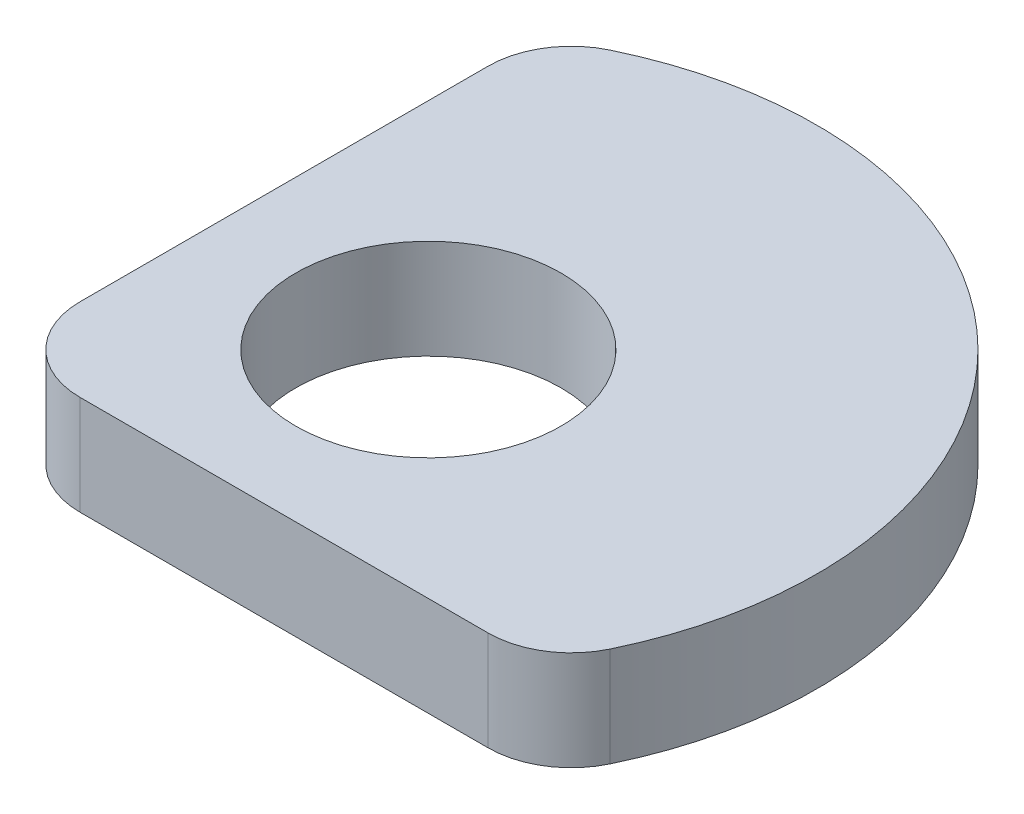
ISO-10303-21;
HEADER;
FILE_DESCRIPTION(('STEP AP214'),'2;1');
FILE_NAME('part.step','',(''),(''),'','','');
FILE_SCHEMA(('AUTOMOTIVE_DESIGN { 1 0 10303 214 1 1 1 1 }'));
ENDSEC;
DATA;
#1=APPLICATION_CONTEXT('core data for automotive mechanical design processes');
#2=APPLICATION_PROTOCOL_DEFINITION('international standard','automotive_design',2000,#1);
#3=PRODUCT_CONTEXT('',#1,'mechanical');
#4=PRODUCT('Part','Part','',(#3));
#5=PRODUCT_RELATED_PRODUCT_CATEGORY('part','',(#4));
#6=PRODUCT_DEFINITION_FORMATION('','',#4);
#7=PRODUCT_DEFINITION_CONTEXT('part definition',#1,'design');
#8=PRODUCT_DEFINITION('design','',#6,#7);
#9=PRODUCT_DEFINITION_SHAPE('','',#8);
#10=(LENGTH_UNIT() NAMED_UNIT(*) SI_UNIT(.MILLI.,.METRE.));
#11=(NAMED_UNIT(*) PLANE_ANGLE_UNIT() SI_UNIT($,.RADIAN.));
#12=(NAMED_UNIT(*) SI_UNIT($,.STERADIAN.) SOLID_ANGLE_UNIT());
#13=UNCERTAINTY_MEASURE_WITH_UNIT(LENGTH_MEASURE(1.E-05),#10,'distance_accuracy_value','');
#14=(GEOMETRIC_REPRESENTATION_CONTEXT(3) GLOBAL_UNCERTAINTY_ASSIGNED_CONTEXT((#13)) GLOBAL_UNIT_ASSIGNED_CONTEXT((#10,
#11,#12)) REPRESENTATION_CONTEXT('',''));
#15=CARTESIAN_POINT('',(0.,0.,0.));
#16=DIRECTION('',(0.,0.,1.));
#17=DIRECTION('',(1.,0.,0.));
#18=AXIS2_PLACEMENT_3D('',#15,#16,#17);
#19=CARTESIAN_POINT('',(2.6,1.2,-2.6));
#20=DIRECTION('',(0.,-1.,0.));
#21=DIRECTION('',(0.,0.,-1.));
#22=AXIS2_PLACEMENT_3D('',#19,#20,#21);
#23=PLANE('',#22);
#24=CARTESIAN_POINT('',(2.6,1.2,-2.6));
#25=DIRECTION('',(0.,1.,0.));
#26=DIRECTION('',(0.,0.,-1.));
#27=AXIS2_PLACEMENT_3D('',#24,#25,#26);
#28=CIRCLE('',#27,4.68721665810319);
#29=CARTESIAN_POINT('',(6.82292813724663,1.2,-0.566068352266805));
#30=VERTEX_POINT('',#29);
#31=CARTESIAN_POINT('',(0.566068352266805,1.2,-6.82292813724663));
#32=VERTEX_POINT('',#31);
#33=EDGE_CURVE('E134',#30,#32,#28,.T.);
#34=ORIENTED_EDGE('',*,*,#33,.T.);
#35=CARTESIAN_POINT('',(1.,1.2,-5.92198234248673));
#36=DIRECTION('',(0.,-1.,0.));
#37=DIRECTION('',(0.,0.,-1.));
#38=AXIS2_PLACEMENT_3D('',#35,#36,#37);
#39=CIRCLE('',#38,1.);
#40=CARTESIAN_POINT('',(0.,1.2,-5.92198234248673));
#41=VERTEX_POINT('',#40);
#42=EDGE_CURVE('E155',#32,#41,#39,.F.);
#43=ORIENTED_EDGE('',*,*,#42,.T.);
#44=DIRECTION('',(0.,0.,1.));
#45=VECTOR('',#44,1.);
#46=CARTESIAN_POINT('',(0.,1.2,0.));
#47=LINE('',#46,#45);
#48=CARTESIAN_POINT('',(0.,1.2,-1.));
#49=VERTEX_POINT('',#48);
#50=EDGE_CURVE('E114',#41,#49,#47,.T.);
#51=ORIENTED_EDGE('',*,*,#50,.T.);
#52=CARTESIAN_POINT('',(1.,1.2,-1.));
#53=DIRECTION('',(0.,-1.,0.));
#54=DIRECTION('',(0.,0.,-1.));
#55=AXIS2_PLACEMENT_3D('',#52,#53,#54);
#56=CIRCLE('',#55,1.);
#57=CARTESIAN_POINT('',(1.,1.2,0.));
#58=VERTEX_POINT('',#57);
#59=EDGE_CURVE('E61',#49,#58,#56,.F.);
#60=ORIENTED_EDGE('',*,*,#59,.T.);
#61=DIRECTION('',(1.,0.,0.));
#62=VECTOR('',#61,1.);
#63=CARTESIAN_POINT('',(0.,1.2,0.));
#64=LINE('',#63,#62);
#65=CARTESIAN_POINT('',(5.92198234248673,1.2,0.));
#66=VERTEX_POINT('',#65);
#67=EDGE_CURVE('E161',#58,#66,#64,.T.);
#68=ORIENTED_EDGE('',*,*,#67,.T.);
#69=CARTESIAN_POINT('',(5.92198234248673,1.2,-1.));
#70=DIRECTION('',(0.,-1.,0.));
#71=DIRECTION('',(0.,0.,-1.));
#72=AXIS2_PLACEMENT_3D('',#69,#70,#71);
#73=CIRCLE('',#72,1.);
#74=EDGE_CURVE('E150',#66,#30,#73,.F.);
#75=ORIENTED_EDGE('',*,*,#74,.T.);
#76=EDGE_LOOP('',(#34,#43,#51,#60,#68,#75));
#77=FACE_BOUND('',#76,.T.);
#78=CARTESIAN_POINT('',(2.6,1.2,-2.6));
#79=DIRECTION('',(0.,1.,0.));
#80=DIRECTION('',(0.,0.,1.));
#81=AXIS2_PLACEMENT_3D('',#78,#79,#80);
#82=CIRCLE('',#81,1.6);
#83=CARTESIAN_POINT('',(2.6,1.2,-1.));
#84=VERTEX_POINT('',#83);
#85=EDGE_CURVE('E124',#84,#84,#82,.T.);
#86=ORIENTED_EDGE('',*,*,#85,.F.);
#87=EDGE_LOOP('',(#86));
#88=FACE_BOUND('',#87,.T.);
#89=ADVANCED_FACE('F39',(#77,#88),#23,.F.);
#90=CARTESIAN_POINT('',(2.6,0.,-2.6));
#91=DIRECTION('',(0.,-1.,0.));
#92=DIRECTION('',(0.,0.,-1.));
#93=AXIS2_PLACEMENT_3D('',#90,#91,#92);
#94=PLANE('',#93);
#95=DIRECTION('',(0.,0.,1.));
#96=VECTOR('',#95,1.);
#97=CARTESIAN_POINT('',(0.,0.,0.));
#98=LINE('',#97,#96);
#99=CARTESIAN_POINT('',(0.,0.,-5.92198234248673));
#100=VERTEX_POINT('',#99);
#101=CARTESIAN_POINT('',(0.,0.,-1.));
#102=VERTEX_POINT('',#101);
#103=EDGE_CURVE('E112',#100,#102,#98,.T.);
#104=ORIENTED_EDGE('',*,*,#103,.F.);
#105=CARTESIAN_POINT('',(1.,0.,-5.92198234248673));
#106=DIRECTION('',(0.,-1.,0.));
#107=DIRECTION('',(0.,0.,-1.));
#108=AXIS2_PLACEMENT_3D('',#105,#106,#107);
#109=CIRCLE('',#108,1.);
#110=CARTESIAN_POINT('',(0.566068352266805,0.,-6.82292813724663));
#111=VERTEX_POINT('',#110);
#112=EDGE_CURVE('E94',#100,#111,#109,.T.);
#113=ORIENTED_EDGE('',*,*,#112,.T.);
#114=CARTESIAN_POINT('',(2.6,0.,-2.6));
#115=DIRECTION('',(0.,1.,0.));
#116=DIRECTION('',(0.,0.,-1.));
#117=AXIS2_PLACEMENT_3D('',#114,#115,#116);
#118=CIRCLE('',#117,4.68721665810319);
#119=CARTESIAN_POINT('',(6.82292813724663,0.,-0.566068352266805));
#120=VERTEX_POINT('',#119);
#121=EDGE_CURVE('E128',#120,#111,#118,.T.);
#122=ORIENTED_EDGE('',*,*,#121,.F.);
#123=CARTESIAN_POINT('',(5.92198234248673,0.,-1.));
#124=DIRECTION('',(0.,-1.,0.));
#125=DIRECTION('',(0.,0.,-1.));
#126=AXIS2_PLACEMENT_3D('',#123,#124,#125);
#127=CIRCLE('',#126,1.);
#128=CARTESIAN_POINT('',(5.92198234248673,0.,0.));
#129=VERTEX_POINT('',#128);
#130=EDGE_CURVE('E116',#120,#129,#127,.T.);
#131=ORIENTED_EDGE('',*,*,#130,.T.);
#132=DIRECTION('',(1.,0.,0.));
#133=VECTOR('',#132,1.);
#134=CARTESIAN_POINT('',(0.,0.,0.));
#135=LINE('',#134,#133);
#136=CARTESIAN_POINT('',(1.,0.,0.));
#137=VERTEX_POINT('',#136);
#138=EDGE_CURVE('E123',#137,#129,#135,.T.);
#139=ORIENTED_EDGE('',*,*,#138,.F.);
#140=CARTESIAN_POINT('',(1.,0.,-1.));
#141=DIRECTION('',(0.,-1.,0.));
#142=DIRECTION('',(0.,0.,-1.));
#143=AXIS2_PLACEMENT_3D('',#140,#141,#142);
#144=CIRCLE('',#143,1.);
#145=EDGE_CURVE('E106',#137,#102,#144,.T.);
#146=ORIENTED_EDGE('',*,*,#145,.T.);
#147=EDGE_LOOP('',(#104,#113,#122,#131,#139,#146));
#148=FACE_BOUND('',#147,.T.);
#149=CARTESIAN_POINT('',(2.6,0.,-2.6));
#150=DIRECTION('',(0.,1.,0.));
#151=DIRECTION('',(0.,0.,1.));
#152=AXIS2_PLACEMENT_3D('',#149,#150,#151);
#153=CIRCLE('',#152,1.6);
#154=CARTESIAN_POINT('',(2.6,0.,-1.));
#155=VERTEX_POINT('',#154);
#156=EDGE_CURVE('E131',#155,#155,#153,.T.);
#157=ORIENTED_EDGE('',*,*,#156,.T.);
#158=EDGE_LOOP('',(#157));
#159=FACE_BOUND('',#158,.T.);
#160=ADVANCED_FACE('F119',(#148,#159),#94,.T.);
#161=CARTESIAN_POINT('',(0.,1.2,0.));
#162=DIRECTION('',(1.,0.,0.));
#163=DIRECTION('',(0.,0.,-1.));
#164=AXIS2_PLACEMENT_3D('',#161,#162,#163);
#165=PLANE('',#164);
#166=ORIENTED_EDGE('',*,*,#50,.F.);
#167=DIRECTION('',(0.,-1.,0.));
#168=VECTOR('',#167,1.);
#169=CARTESIAN_POINT('',(0.,1.2,-5.92198234248673));
#170=LINE('',#169,#168);
#171=EDGE_CURVE('E98',#41,#100,#170,.T.);
#172=ORIENTED_EDGE('',*,*,#171,.T.);
#173=ORIENTED_EDGE('',*,*,#103,.T.);
#174=DIRECTION('',(0.,-1.,0.));
#175=VECTOR('',#174,1.);
#176=CARTESIAN_POINT('',(0.,1.2,-1.));
#177=LINE('',#176,#175);
#178=EDGE_CURVE('E117',#102,#49,#177,.F.);
#179=ORIENTED_EDGE('',*,*,#178,.T.);
#180=EDGE_LOOP('',(#166,#172,#173,#179));
#181=FACE_BOUND('',#180,.T.);
#182=ADVANCED_FACE('F111',(#181),#165,.F.);
#183=CARTESIAN_POINT('',(0.,1.2,0.));
#184=DIRECTION('',(0.,0.,-1.));
#185=DIRECTION('',(-1.,0.,0.));
#186=AXIS2_PLACEMENT_3D('',#183,#184,#185);
#187=PLANE('',#186);
#188=ORIENTED_EDGE('',*,*,#67,.F.);
#189=DIRECTION('',(0.,-1.,0.));
#190=VECTOR('',#189,1.);
#191=CARTESIAN_POINT('',(1.,1.2,0.));
#192=LINE('',#191,#190);
#193=EDGE_CURVE('E11',#58,#137,#192,.T.);
#194=ORIENTED_EDGE('',*,*,#193,.T.);
#195=ORIENTED_EDGE('',*,*,#138,.T.);
#196=DIRECTION('',(0.,-1.,0.));
#197=VECTOR('',#196,1.);
#198=CARTESIAN_POINT('',(5.92198234248673,1.2,0.));
#199=LINE('',#198,#197);
#200=EDGE_CURVE('E48',#129,#66,#199,.F.);
#201=ORIENTED_EDGE('',*,*,#200,.T.);
#202=EDGE_LOOP('',(#188,#194,#195,#201));
#203=FACE_BOUND('',#202,.T.);
#204=ADVANCED_FACE('F180',(#203),#187,.F.);
#205=CARTESIAN_POINT('',(2.6,1.2,-2.6));
#206=DIRECTION('',(0.,-1.,0.));
#207=DIRECTION('',(0.,0.,-1.));
#208=AXIS2_PLACEMENT_3D('',#205,#206,#207);
#209=CYLINDRICAL_SURFACE('',#208,4.68721665810319);
#210=ORIENTED_EDGE('',*,*,#121,.T.);
#211=DIRECTION('',(0.,-1.,0.));
#212=VECTOR('',#211,1.);
#213=CARTESIAN_POINT('',(0.566068352266805,1.2,-6.82292813724663));
#214=LINE('',#213,#212);
#215=EDGE_CURVE('E99',#111,#32,#214,.F.);
#216=ORIENTED_EDGE('',*,*,#215,.T.);
#217=ORIENTED_EDGE('',*,*,#33,.F.);
#218=DIRECTION('',(0.,-1.,0.));
#219=VECTOR('',#218,1.);
#220=CARTESIAN_POINT('',(6.82292813724663,1.2,-0.566068352266805));
#221=LINE('',#220,#219);
#222=EDGE_CURVE('E105',#30,#120,#221,.T.);
#223=ORIENTED_EDGE('',*,*,#222,.T.);
#224=EDGE_LOOP('',(#210,#216,#217,#223));
#225=FACE_BOUND('',#224,.T.);
#226=ADVANCED_FACE('F171',(#225),#209,.T.);
#227=CARTESIAN_POINT('',(2.6,1.2,-2.6));
#228=DIRECTION('',(0.,-1.,0.));
#229=DIRECTION('',(0.,0.,-1.));
#230=AXIS2_PLACEMENT_3D('',#227,#228,#229);
#231=CYLINDRICAL_SURFACE('',#230,1.6);
#232=ORIENTED_EDGE('',*,*,#85,.T.);
#233=EDGE_LOOP('',(#232));
#234=FACE_BOUND('',#233,.T.);
#235=ORIENTED_EDGE('',*,*,#156,.F.);
#236=EDGE_LOOP('',(#235));
#237=FACE_BOUND('',#236,.T.);
#238=ADVANCED_FACE('F169',(#234,#237),#231,.F.);
#239=CARTESIAN_POINT('',(1.,1.2,-5.92198234248673));
#240=DIRECTION('',(0.,-1.,0.));
#241=DIRECTION('',(0.,0.,-1.));
#242=AXIS2_PLACEMENT_3D('',#239,#240,#241);
#243=CYLINDRICAL_SURFACE('',#242,1.);
#244=ORIENTED_EDGE('',*,*,#42,.F.);
#245=ORIENTED_EDGE('',*,*,#215,.F.);
#246=ORIENTED_EDGE('',*,*,#112,.F.);
#247=ORIENTED_EDGE('',*,*,#171,.F.);
#248=EDGE_LOOP('',(#244,#245,#246,#247));
#249=FACE_BOUND('',#248,.T.);
#250=ADVANCED_FACE('F97',(#249),#243,.T.);
#251=CARTESIAN_POINT('',(1.,1.2,-1.));
#252=DIRECTION('',(0.,-1.,0.));
#253=DIRECTION('',(0.,0.,-1.));
#254=AXIS2_PLACEMENT_3D('',#251,#252,#253);
#255=CYLINDRICAL_SURFACE('',#254,1.);
#256=ORIENTED_EDGE('',*,*,#59,.F.);
#257=ORIENTED_EDGE('',*,*,#178,.F.);
#258=ORIENTED_EDGE('',*,*,#145,.F.);
#259=ORIENTED_EDGE('',*,*,#193,.F.);
#260=EDGE_LOOP('',(#256,#257,#258,#259));
#261=FACE_BOUND('',#260,.T.);
#262=ADVANCED_FACE('F178',(#261),#255,.T.);
#263=CARTESIAN_POINT('',(5.92198234248673,1.2,-1.));
#264=DIRECTION('',(0.,-1.,0.));
#265=DIRECTION('',(0.,0.,-1.));
#266=AXIS2_PLACEMENT_3D('',#263,#264,#265);
#267=CYLINDRICAL_SURFACE('',#266,1.);
#268=ORIENTED_EDGE('',*,*,#74,.F.);
#269=ORIENTED_EDGE('',*,*,#200,.F.);
#270=ORIENTED_EDGE('',*,*,#130,.F.);
#271=ORIENTED_EDGE('',*,*,#222,.F.);
#272=EDGE_LOOP('',(#268,#269,#270,#271));
#273=FACE_BOUND('',#272,.T.);
#274=ADVANCED_FACE('F41',(#273),#267,.T.);
#275=CLOSED_SHELL('',(#89,#160,#182,#204,#226,#238,#250,#262,#274));
#276=MANIFOLD_SOLID_BREP('B2',#275);
#277=ADVANCED_BREP_SHAPE_REPRESENTATION('',(#18,#276),#14);
#278=SHAPE_DEFINITION_REPRESENTATION(#9,#277);
ENDSEC;
END-ISO-10303-21;
